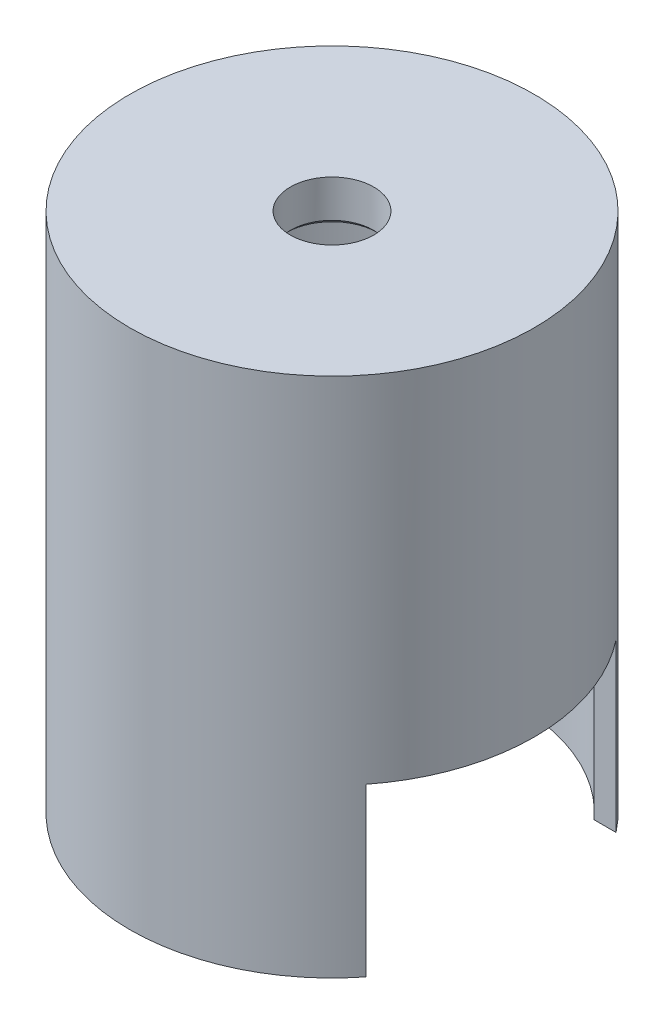
ISO-10303-21;
HEADER;
FILE_DESCRIPTION(('STEP AP214'),'2;1');
FILE_NAME('part.step','',(''),(''),'','','');
FILE_SCHEMA(('AUTOMOTIVE_DESIGN { 1 0 10303 214 1 1 1 1 }'));
ENDSEC;
DATA;
#1=APPLICATION_CONTEXT('core data for automotive mechanical design processes');
#2=APPLICATION_PROTOCOL_DEFINITION('international standard','automotive_design',2000,#1);
#3=PRODUCT_CONTEXT('',#1,'mechanical');
#4=PRODUCT('Part','Part','',(#3));
#5=PRODUCT_RELATED_PRODUCT_CATEGORY('part','',(#4));
#6=PRODUCT_DEFINITION_FORMATION('','',#4);
#7=PRODUCT_DEFINITION_CONTEXT('part definition',#1,'design');
#8=PRODUCT_DEFINITION('design','',#6,#7);
#9=PRODUCT_DEFINITION_SHAPE('','',#8);
#10=(LENGTH_UNIT() NAMED_UNIT(*) SI_UNIT(.MILLI.,.METRE.));
#11=(NAMED_UNIT(*) PLANE_ANGLE_UNIT() SI_UNIT($,.RADIAN.));
#12=(NAMED_UNIT(*) SI_UNIT($,.STERADIAN.) SOLID_ANGLE_UNIT());
#13=UNCERTAINTY_MEASURE_WITH_UNIT(LENGTH_MEASURE(1.E-05),#10,'distance_accuracy_value','');
#14=(GEOMETRIC_REPRESENTATION_CONTEXT(3) GLOBAL_UNCERTAINTY_ASSIGNED_CONTEXT((#13)) GLOBAL_UNIT_ASSIGNED_CONTEXT((#10,
#11,#12)) REPRESENTATION_CONTEXT('',''));
#15=CARTESIAN_POINT('',(0.,0.,0.));
#16=DIRECTION('',(0.,0.,1.));
#17=DIRECTION('',(1.,0.,0.));
#18=AXIS2_PLACEMENT_3D('',#15,#16,#17);
#19=CARTESIAN_POINT('',(0.,0.,0.));
#20=DIRECTION('',(0.,1.,0.));
#21=DIRECTION('',(0.,0.,1.));
#22=AXIS2_PLACEMENT_3D('',#19,#20,#21);
#23=PLANE('',#22);
#24=CARTESIAN_POINT('',(0.,0.,0.));
#25=DIRECTION('',(0.,1.,0.));
#26=DIRECTION('',(0.,0.,1.));
#27=AXIS2_PLACEMENT_3D('',#24,#25,#26);
#28=CIRCLE('',#27,9.7);
#29=CARTESIAN_POINT('',(-7.62167960491649,0.,6.));
#30=VERTEX_POINT('',#29);
#31=CARTESIAN_POINT('',(7.62167960491649,0.,6.));
#32=VERTEX_POINT('',#31);
#33=EDGE_CURVE('E177',#30,#32,#28,.T.);
#34=ORIENTED_EDGE('',*,*,#33,.F.);
#35=DIRECTION('',(1.,0.,0.));
#36=VECTOR('',#35,1.);
#37=CARTESIAN_POINT('',(0.,0.,6.));
#38=LINE('',#37,#36);
#39=CARTESIAN_POINT('',(-6.57343137181792,0.,6.));
#40=VERTEX_POINT('',#39);
#41=EDGE_CURVE('E165',#30,#40,#38,.T.);
#42=ORIENTED_EDGE('',*,*,#41,.T.);
#43=CARTESIAN_POINT('',(0.,0.,0.));
#44=DIRECTION('',(0.,-1.,0.));
#45=DIRECTION('',(0.,0.,-1.));
#46=AXIS2_PLACEMENT_3D('',#43,#44,#45);
#47=CIRCLE('',#46,8.9);
#48=CARTESIAN_POINT('',(6.57343137181792,0.,6.));
#49=VERTEX_POINT('',#48);
#50=EDGE_CURVE('E178',#49,#40,#47,.T.);
#51=ORIENTED_EDGE('',*,*,#50,.F.);
#52=EDGE_CURVE('E160',#49,#32,#38,.T.);
#53=ORIENTED_EDGE('',*,*,#52,.T.);
#54=EDGE_LOOP('',(#34,#42,#51,#53));
#55=FACE_BOUND('',#54,.T.);
#56=ADVANCED_FACE('F51',(#55),#23,.F.);
#57=CARTESIAN_POINT('',(0.,25.,0.));
#58=DIRECTION('',(0.,-1.,0.));
#59=DIRECTION('',(0.,0.,-1.));
#60=AXIS2_PLACEMENT_3D('',#57,#58,#59);
#61=CYLINDRICAL_SURFACE('',#60,9.7);
#62=CARTESIAN_POINT('',(0.,25.,0.));
#63=DIRECTION('',(0.,1.,0.));
#64=DIRECTION('',(0.,0.,1.));
#65=AXIS2_PLACEMENT_3D('',#62,#63,#64);
#66=CIRCLE('',#65,9.7);
#67=CARTESIAN_POINT('',(0.,25.,9.7));
#68=VERTEX_POINT('',#67);
#69=EDGE_CURVE('E182',#68,#68,#66,.T.);
#70=ORIENTED_EDGE('',*,*,#69,.F.);
#71=EDGE_LOOP('',(#70));
#72=FACE_BOUND('',#71,.T.);
#73=ORIENTED_EDGE('',*,*,#33,.T.);
#74=DIRECTION('',(0.,-1.,0.));
#75=VECTOR('',#74,1.);
#76=CARTESIAN_POINT('',(7.62167960491649,25.,6.));
#77=LINE('',#76,#75);
#78=CARTESIAN_POINT('',(7.62167960491649,8.00000000000001,6.));
#79=VERTEX_POINT('',#78);
#80=EDGE_CURVE('E164',#32,#79,#77,.F.);
#81=ORIENTED_EDGE('',*,*,#80,.T.);
#82=CARTESIAN_POINT('',(0.,8.00000000000001,0.));
#83=DIRECTION('',(0.,1.,0.));
#84=DIRECTION('',(0.,0.,1.));
#85=AXIS2_PLACEMENT_3D('',#82,#83,#84);
#86=CIRCLE('',#85,9.7);
#87=CARTESIAN_POINT('',(7.62167960491649,8.00000000000001,-6.));
#88=VERTEX_POINT('',#87);
#89=EDGE_CURVE('E131',#79,#88,#86,.T.);
#90=ORIENTED_EDGE('',*,*,#89,.T.);
#91=DIRECTION('',(0.,-1.,0.));
#92=VECTOR('',#91,1.);
#93=CARTESIAN_POINT('',(7.62167960491649,25.,-6.));
#94=LINE('',#93,#92);
#95=CARTESIAN_POINT('',(7.62167960491649,0.,-6.));
#96=VERTEX_POINT('',#95);
#97=EDGE_CURVE('E132',#88,#96,#94,.T.);
#98=ORIENTED_EDGE('',*,*,#97,.T.);
#99=CARTESIAN_POINT('',(-7.62167960491649,0.,-6.));
#100=VERTEX_POINT('',#99);
#101=EDGE_CURVE('E145',#96,#100,#28,.T.);
#102=ORIENTED_EDGE('',*,*,#101,.T.);
#103=DIRECTION('',(0.,-1.,0.));
#104=VECTOR('',#103,1.);
#105=CARTESIAN_POINT('',(-7.62167960491649,25.,-6.));
#106=LINE('',#105,#104);
#107=CARTESIAN_POINT('',(-7.62167960491649,8.00000000000001,-6.));
#108=VERTEX_POINT('',#107);
#109=EDGE_CURVE('E135',#100,#108,#106,.F.);
#110=ORIENTED_EDGE('',*,*,#109,.T.);
#111=CARTESIAN_POINT('',(-7.62167960491649,8.00000000000001,6.));
#112=VERTEX_POINT('',#111);
#113=EDGE_CURVE('E119',#108,#112,#86,.T.);
#114=ORIENTED_EDGE('',*,*,#113,.T.);
#115=DIRECTION('',(0.,-1.,0.));
#116=VECTOR('',#115,1.);
#117=CARTESIAN_POINT('',(-7.62167960491649,25.,6.));
#118=LINE('',#117,#116);
#119=EDGE_CURVE('E169',#112,#30,#118,.T.);
#120=ORIENTED_EDGE('',*,*,#119,.T.);
#121=EDGE_LOOP('',(#73,#81,#90,#98,#102,#110,#114,#120));
#122=FACE_BOUND('',#121,.T.);
#123=ADVANCED_FACE('F142',(#72,#122),#61,.T.);
#124=CARTESIAN_POINT('',(0.,25.,0.));
#125=DIRECTION('',(0.,1.,0.));
#126=DIRECTION('',(0.,0.,1.));
#127=AXIS2_PLACEMENT_3D('',#124,#125,#126);
#128=PLANE('',#127);
#129=CARTESIAN_POINT('',(0.,25.,0.));
#130=DIRECTION('',(0.,1.,0.));
#131=DIRECTION('',(0.,0.,1.));
#132=AXIS2_PLACEMENT_3D('',#129,#130,#131);
#133=CIRCLE('',#132,2.);
#134=CARTESIAN_POINT('',(0.,25.,2.));
#135=VERTEX_POINT('',#134);
#136=EDGE_CURVE('E254',#135,#135,#133,.T.);
#137=ORIENTED_EDGE('',*,*,#136,.F.);
#138=EDGE_LOOP('',(#137));
#139=FACE_BOUND('',#138,.T.);
#140=ORIENTED_EDGE('',*,*,#69,.T.);
#141=EDGE_LOOP('',(#140));
#142=FACE_BOUND('',#141,.T.);
#143=ADVANCED_FACE('F229',(#139,#142),#128,.T.);
#144=ORIENTED_EDGE('',*,*,#101,.F.);
#145=DIRECTION('',(-1.,0.,0.));
#146=VECTOR('',#145,1.);
#147=CARTESIAN_POINT('',(0.,0.,-6.));
#148=LINE('',#147,#146);
#149=CARTESIAN_POINT('',(6.57343137181792,0.,-6.));
#150=VERTEX_POINT('',#149);
#151=EDGE_CURVE('E147',#96,#150,#148,.T.);
#152=ORIENTED_EDGE('',*,*,#151,.T.);
#153=CARTESIAN_POINT('',(-6.57343137181792,0.,-6.));
#154=VERTEX_POINT('',#153);
#155=EDGE_CURVE('E172',#154,#150,#47,.T.);
#156=ORIENTED_EDGE('',*,*,#155,.F.);
#157=EDGE_CURVE('E76',#154,#100,#148,.T.);
#158=ORIENTED_EDGE('',*,*,#157,.T.);
#159=EDGE_LOOP('',(#144,#152,#156,#158));
#160=FACE_BOUND('',#159,.T.);
#161=ADVANCED_FACE('F225',(#160),#23,.F.);
#162=CARTESIAN_POINT('',(0.,23.,0.));
#163=DIRECTION('',(0.,-1.,0.));
#164=DIRECTION('',(0.,0.,-1.));
#165=AXIS2_PLACEMENT_3D('',#162,#163,#164);
#166=CYLINDRICAL_SURFACE('',#165,8.9);
#167=CARTESIAN_POINT('',(0.,23.,0.));
#168=DIRECTION('',(0.,-1.,0.));
#169=DIRECTION('',(0.,0.,-1.));
#170=AXIS2_PLACEMENT_3D('',#167,#168,#169);
#171=CIRCLE('',#170,8.9);
#172=CARTESIAN_POINT('',(0.,23.,-8.9));
#173=VERTEX_POINT('',#172);
#174=EDGE_CURVE('E173',#173,#173,#171,.T.);
#175=ORIENTED_EDGE('',*,*,#174,.F.);
#176=EDGE_LOOP('',(#175));
#177=FACE_BOUND('',#176,.T.);
#178=CARTESIAN_POINT('',(0.,8.,0.));
#179=DIRECTION('',(0.,1.,0.));
#180=DIRECTION('',(0.,0.,1.));
#181=AXIS2_PLACEMENT_3D('',#178,#179,#180);
#182=CIRCLE('',#181,8.9);
#183=CARTESIAN_POINT('',(6.57343137181792,8.00000000000001,-6.));
#184=VERTEX_POINT('',#183);
#185=CARTESIAN_POINT('',(6.57343137181792,8.,6.));
#186=VERTEX_POINT('',#185);
#187=EDGE_CURVE('E194',#184,#186,#182,.F.);
#188=ORIENTED_EDGE('',*,*,#187,.T.);
#189=DIRECTION('',(0.,-1.,0.));
#190=VECTOR('',#189,1.);
#191=CARTESIAN_POINT('',(6.57343137181792,23.,6.));
#192=LINE('',#191,#190);
#193=EDGE_CURVE('E202',#186,#49,#192,.T.);
#194=ORIENTED_EDGE('',*,*,#193,.T.);
#195=ORIENTED_EDGE('',*,*,#50,.T.);
#196=DIRECTION('',(0.,-1.,0.));
#197=VECTOR('',#196,1.);
#198=CARTESIAN_POINT('',(-6.57343137181792,23.,6.));
#199=LINE('',#198,#197);
#200=CARTESIAN_POINT('',(-6.57343137181792,8.,6.));
#201=VERTEX_POINT('',#200);
#202=EDGE_CURVE('E193',#40,#201,#199,.F.);
#203=ORIENTED_EDGE('',*,*,#202,.T.);
#204=CARTESIAN_POINT('',(-6.57343137181792,8.00000000000001,-6.));
#205=VERTEX_POINT('',#204);
#206=EDGE_CURVE('E190',#201,#205,#182,.F.);
#207=ORIENTED_EDGE('',*,*,#206,.T.);
#208=DIRECTION('',(0.,-1.,0.));
#209=VECTOR('',#208,1.);
#210=CARTESIAN_POINT('',(-6.57343137181792,23.,-6.));
#211=LINE('',#210,#209);
#212=EDGE_CURVE('E136',#205,#154,#211,.T.);
#213=ORIENTED_EDGE('',*,*,#212,.T.);
#214=ORIENTED_EDGE('',*,*,#155,.T.);
#215=DIRECTION('',(0.,-1.,0.));
#216=VECTOR('',#215,1.);
#217=CARTESIAN_POINT('',(6.57343137181792,23.,-6.));
#218=LINE('',#217,#216);
#219=EDGE_CURVE('E198',#150,#184,#218,.F.);
#220=ORIENTED_EDGE('',*,*,#219,.T.);
#221=EDGE_LOOP('',(#188,#194,#195,#203,#207,#213,#214,#220));
#222=FACE_BOUND('',#221,.T.);
#223=ADVANCED_FACE('F234',(#177,#222),#166,.F.);
#224=CARTESIAN_POINT('',(0.,23.,0.));
#225=DIRECTION('',(0.,-1.,0.));
#226=DIRECTION('',(0.,0.,-1.));
#227=AXIS2_PLACEMENT_3D('',#224,#225,#226);
#228=PLANE('',#227);
#229=CARTESIAN_POINT('',(0.,23.,0.));
#230=DIRECTION('',(0.,-1.,0.));
#231=DIRECTION('',(0.,0.,-1.));
#232=AXIS2_PLACEMENT_3D('',#229,#230,#231);
#233=CIRCLE('',#232,2.2);
#234=CARTESIAN_POINT('',(0.,23.,-2.2));
#235=VERTEX_POINT('',#234);
#236=EDGE_CURVE('E11',#235,#235,#233,.F.);
#237=ORIENTED_EDGE('',*,*,#236,.T.);
#238=EDGE_LOOP('',(#237));
#239=FACE_BOUND('',#238,.T.);
#240=ORIENTED_EDGE('',*,*,#174,.T.);
#241=EDGE_LOOP('',(#240));
#242=FACE_BOUND('',#241,.T.);
#243=ADVANCED_FACE('F239',(#239,#242),#228,.T.);
#244=CARTESIAN_POINT('',(-9.7,-7.99999999999999,-6.));
#245=DIRECTION('',(0.,0.,-1.));
#246=DIRECTION('',(-1.,0.,0.));
#247=AXIS2_PLACEMENT_3D('',#244,#245,#246);
#248=PLANE('',#247);
#249=ORIENTED_EDGE('',*,*,#157,.F.);
#250=ORIENTED_EDGE('',*,*,#212,.F.);
#251=DIRECTION('',(1.,0.,0.));
#252=VECTOR('',#251,1.);
#253=CARTESIAN_POINT('',(-9.7,8.00000000000001,-6.));
#254=LINE('',#253,#252);
#255=EDGE_CURVE('E122',#108,#205,#254,.T.);
#256=ORIENTED_EDGE('',*,*,#255,.F.);
#257=ORIENTED_EDGE('',*,*,#109,.F.);
#258=EDGE_LOOP('',(#249,#250,#256,#257));
#259=FACE_BOUND('',#258,.T.);
#260=ADVANCED_FACE('F134',(#259),#248,.F.);
#261=CARTESIAN_POINT('',(-9.7,8.00000000000001,-6.));
#262=DIRECTION('',(0.,1.,0.));
#263=DIRECTION('',(0.,0.,1.));
#264=AXIS2_PLACEMENT_3D('',#261,#262,#263);
#265=PLANE('',#264);
#266=ORIENTED_EDGE('',*,*,#255,.T.);
#267=ORIENTED_EDGE('',*,*,#206,.F.);
#268=DIRECTION('',(1.,0.,0.));
#269=VECTOR('',#268,1.);
#270=CARTESIAN_POINT('',(-9.7,8.,6.));
#271=LINE('',#270,#269);
#272=EDGE_CURVE('E125',#112,#201,#271,.T.);
#273=ORIENTED_EDGE('',*,*,#272,.F.);
#274=ORIENTED_EDGE('',*,*,#113,.F.);
#275=EDGE_LOOP('',(#266,#267,#273,#274));
#276=FACE_BOUND('',#275,.T.);
#277=ADVANCED_FACE('F121',(#276),#265,.F.);
#278=CARTESIAN_POINT('',(-9.7,-8.,6.));
#279=DIRECTION('',(0.,0.,1.));
#280=DIRECTION('',(1.,0.,0.));
#281=AXIS2_PLACEMENT_3D('',#278,#279,#280);
#282=PLANE('',#281);
#283=ORIENTED_EDGE('',*,*,#272,.T.);
#284=ORIENTED_EDGE('',*,*,#202,.F.);
#285=ORIENTED_EDGE('',*,*,#41,.F.);
#286=ORIENTED_EDGE('',*,*,#119,.F.);
#287=EDGE_LOOP('',(#283,#284,#285,#286));
#288=FACE_BOUND('',#287,.T.);
#289=ADVANCED_FACE('F322',(#288),#282,.F.);
#290=ORIENTED_EDGE('',*,*,#52,.F.);
#291=ORIENTED_EDGE('',*,*,#193,.F.);
#292=EDGE_CURVE('E138',#186,#79,#271,.T.);
#293=ORIENTED_EDGE('',*,*,#292,.T.);
#294=ORIENTED_EDGE('',*,*,#80,.F.);
#295=EDGE_LOOP('',(#290,#291,#293,#294));
#296=FACE_BOUND('',#295,.T.);
#297=ADVANCED_FACE('F320',(#296),#282,.F.);
#298=ORIENTED_EDGE('',*,*,#292,.F.);
#299=ORIENTED_EDGE('',*,*,#187,.F.);
#300=EDGE_CURVE('E68',#184,#88,#254,.T.);
#301=ORIENTED_EDGE('',*,*,#300,.T.);
#302=ORIENTED_EDGE('',*,*,#89,.F.);
#303=EDGE_LOOP('',(#298,#299,#301,#302));
#304=FACE_BOUND('',#303,.T.);
#305=ADVANCED_FACE('F318',(#304),#265,.F.);
#306=ORIENTED_EDGE('',*,*,#300,.F.);
#307=ORIENTED_EDGE('',*,*,#219,.F.);
#308=ORIENTED_EDGE('',*,*,#151,.F.);
#309=ORIENTED_EDGE('',*,*,#97,.F.);
#310=EDGE_LOOP('',(#306,#307,#308,#309));
#311=FACE_BOUND('',#310,.T.);
#312=ADVANCED_FACE('F219',(#311),#248,.F.);
#313=CARTESIAN_POINT('',(0.,0.,0.));
#314=DIRECTION('',(0.,1.,0.));
#315=DIRECTION('',(0.,0.,1.));
#316=AXIS2_PLACEMENT_3D('',#313,#314,#315);
#317=CYLINDRICAL_SURFACE('',#316,2.);
#318=CARTESIAN_POINT('',(0.,23.2,0.));
#319=DIRECTION('',(0.,-1.,0.));
#320=DIRECTION('',(0.,0.,-1.));
#321=AXIS2_PLACEMENT_3D('',#318,#319,#320);
#322=CIRCLE('',#321,2.);
#323=CARTESIAN_POINT('',(0.,23.2,-2.));
#324=VERTEX_POINT('',#323);
#325=EDGE_CURVE('E61',#324,#324,#322,.T.);
#326=ORIENTED_EDGE('',*,*,#325,.T.);
#327=EDGE_LOOP('',(#326));
#328=FACE_BOUND('',#327,.T.);
#329=ORIENTED_EDGE('',*,*,#136,.T.);
#330=EDGE_LOOP('',(#329));
#331=FACE_BOUND('',#330,.T.);
#332=ADVANCED_FACE('F211',(#328,#331),#317,.F.);
#333=CARTESIAN_POINT('',(0.,23.2,0.));
#334=DIRECTION('',(0.,-1.,0.));
#335=DIRECTION('',(0.,0.,-1.));
#336=AXIS2_PLACEMENT_3D('',#333,#334,#335);
#337=CONICAL_SURFACE('',#336,2.,0.785398163397453);
#338=ORIENTED_EDGE('',*,*,#236,.F.);
#339=EDGE_LOOP('',(#338));
#340=FACE_BOUND('',#339,.T.);
#341=ORIENTED_EDGE('',*,*,#325,.F.);
#342=EDGE_LOOP('',(#341));
#343=FACE_BOUND('',#342,.T.);
#344=ADVANCED_FACE('F54',(#340,#343),#337,.F.);
#345=CLOSED_SHELL('',(#56,#123,#143,#161,#223,#243,#260,#277,#289,#297,#305,#312,#332,#344));
#346=MANIFOLD_SOLID_BREP('B2',#345);
#347=ADVANCED_BREP_SHAPE_REPRESENTATION('',(#18,#346),#14);
#348=SHAPE_DEFINITION_REPRESENTATION(#9,#347);
ENDSEC;
END-ISO-10303-21;
